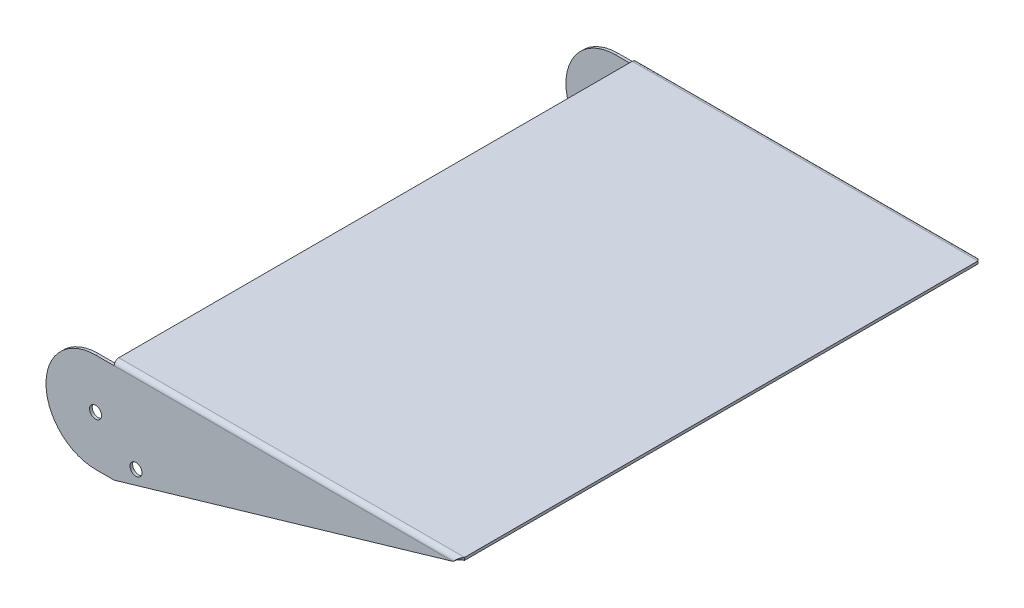
ISO-10303-21;
HEADER;
FILE_DESCRIPTION(('STEP AP214'),'2;1');
FILE_NAME('part.step','',(''),(''),'','','');
FILE_SCHEMA(('AUTOMOTIVE_DESIGN { 1 0 10303 214 1 1 1 1 }'));
ENDSEC;
DATA;
#1=APPLICATION_CONTEXT('core data for automotive mechanical design processes');
#2=APPLICATION_PROTOCOL_DEFINITION('international standard','automotive_design',2000,#1);
#3=PRODUCT_CONTEXT('',#1,'mechanical');
#4=PRODUCT('Part','Part','',(#3));
#5=PRODUCT_RELATED_PRODUCT_CATEGORY('part','',(#4));
#6=PRODUCT_DEFINITION_FORMATION('','',#4);
#7=PRODUCT_DEFINITION_CONTEXT('part definition',#1,'design');
#8=PRODUCT_DEFINITION('design','',#6,#7);
#9=PRODUCT_DEFINITION_SHAPE('','',#8);
#10=(LENGTH_UNIT() NAMED_UNIT(*) SI_UNIT(.MILLI.,.METRE.));
#11=(NAMED_UNIT(*) PLANE_ANGLE_UNIT() SI_UNIT($,.RADIAN.));
#12=(NAMED_UNIT(*) SI_UNIT($,.STERADIAN.) SOLID_ANGLE_UNIT());
#13=UNCERTAINTY_MEASURE_WITH_UNIT(LENGTH_MEASURE(1.E-05),#10,'distance_accuracy_value','');
#14=(GEOMETRIC_REPRESENTATION_CONTEXT(3) GLOBAL_UNCERTAINTY_ASSIGNED_CONTEXT((#13)) GLOBAL_UNIT_ASSIGNED_CONTEXT((#10,
#11,#12)) REPRESENTATION_CONTEXT('',''));
#15=CARTESIAN_POINT('',(0.,0.,0.));
#16=DIRECTION('',(0.,0.,1.));
#17=DIRECTION('',(1.,0.,0.));
#18=AXIS2_PLACEMENT_3D('',#15,#16,#17);
#19=CARTESIAN_POINT('',(65.,-1.,-96.5));
#20=DIRECTION('',(1.,0.,0.));
#21=DIRECTION('',(0.,0.,-1.));
#22=AXIS2_PLACEMENT_3D('',#19,#20,#21);
#23=PLANE('',#22);
#24=DIRECTION('',(0.,0.,-1.));
#25=VECTOR('',#24,1.);
#26=CARTESIAN_POINT('',(65.,0.,-96.5));
#27=LINE('',#26,#25);
#28=CARTESIAN_POINT('',(65.,0.,96.5));
#29=VERTEX_POINT('',#28);
#30=CARTESIAN_POINT('',(65.,0.,-96.5));
#31=VERTEX_POINT('',#30);
#32=EDGE_CURVE('E288',#29,#31,#27,.T.);
#33=ORIENTED_EDGE('',*,*,#32,.F.);
#34=DIRECTION('',(0.,1.,0.));
#35=VECTOR('',#34,1.);
#36=CARTESIAN_POINT('',(65.,-1.,96.5));
#37=LINE('',#36,#35);
#38=CARTESIAN_POINT('',(65.,-0.999999999999987,96.5));
#39=VERTEX_POINT('',#38);
#40=EDGE_CURVE('E13',#39,#29,#37,.T.);
#41=ORIENTED_EDGE('',*,*,#40,.F.);
#42=DIRECTION('',(0.,0.,-1.));
#43=VECTOR('',#42,1.);
#44=CARTESIAN_POINT('',(65.,-1.,-96.5));
#45=LINE('',#44,#43);
#46=CARTESIAN_POINT('',(65.,-0.99999999999999,-96.5));
#47=VERTEX_POINT('',#46);
#48=EDGE_CURVE('E304',#39,#47,#45,.T.);
#49=ORIENTED_EDGE('',*,*,#48,.T.);
#50=DIRECTION('',(0.,1.,0.));
#51=VECTOR('',#50,1.);
#52=CARTESIAN_POINT('',(65.,-1.,-96.5));
#53=LINE('',#52,#51);
#54=EDGE_CURVE('E292',#47,#31,#53,.T.);
#55=ORIENTED_EDGE('',*,*,#54,.T.);
#56=EDGE_LOOP('',(#33,#41,#49,#55));
#57=FACE_BOUND('',#56,.T.);
#58=ADVANCED_FACE('F70',(#57),#23,.T.);
#59=CARTESIAN_POINT('',(-65.,-1.,-96.5));
#60=DIRECTION('',(-1.,0.,0.));
#61=DIRECTION('',(0.,0.,1.));
#62=AXIS2_PLACEMENT_3D('',#59,#60,#61);
#63=PLANE('',#62);
#64=DIRECTION('',(0.,0.,1.));
#65=VECTOR('',#64,1.);
#66=CARTESIAN_POINT('',(-65.,0.,-96.5));
#67=LINE('',#66,#65);
#68=CARTESIAN_POINT('',(-65.,0.,-96.5));
#69=VERTEX_POINT('',#68);
#70=CARTESIAN_POINT('',(-65.,0.,96.5));
#71=VERTEX_POINT('',#70);
#72=EDGE_CURVE('E301',#69,#71,#67,.T.);
#73=ORIENTED_EDGE('',*,*,#72,.F.);
#74=DIRECTION('',(0.,1.,0.));
#75=VECTOR('',#74,1.);
#76=CARTESIAN_POINT('',(-65.,-1.,-96.5));
#77=LINE('',#76,#75);
#78=CARTESIAN_POINT('',(-65.,-1.00000000000001,-96.5));
#79=VERTEX_POINT('',#78);
#80=EDGE_CURVE('E313',#79,#69,#77,.T.);
#81=ORIENTED_EDGE('',*,*,#80,.F.);
#82=DIRECTION('',(0.,0.,1.));
#83=VECTOR('',#82,1.);
#84=CARTESIAN_POINT('',(-65.,-1.,-96.5));
#85=LINE('',#84,#83);
#86=CARTESIAN_POINT('',(-65.,-0.999999999999987,96.5));
#87=VERTEX_POINT('',#86);
#88=EDGE_CURVE('E315',#79,#87,#85,.T.);
#89=ORIENTED_EDGE('',*,*,#88,.T.);
#90=DIRECTION('',(0.,1.,0.));
#91=VECTOR('',#90,1.);
#92=CARTESIAN_POINT('',(-65.,-1.,96.5));
#93=LINE('',#92,#91);
#94=EDGE_CURVE('E78',#87,#71,#93,.T.);
#95=ORIENTED_EDGE('',*,*,#94,.T.);
#96=EDGE_LOOP('',(#73,#81,#89,#95));
#97=FACE_BOUND('',#96,.T.);
#98=ADVANCED_FACE('F277',(#97),#63,.T.);
#99=CARTESIAN_POINT('',(0.,-1.,0.));
#100=DIRECTION('',(0.,1.,0.));
#101=DIRECTION('',(0.,0.,1.));
#102=AXIS2_PLACEMENT_3D('',#99,#100,#101);
#103=PLANE('',#102);
#104=ORIENTED_EDGE('',*,*,#48,.F.);
#105=DIRECTION('',(1.,0.,0.));
#106=VECTOR('',#105,1.);
#107=CARTESIAN_POINT('',(-65.,-1.,96.5));
#108=LINE('',#107,#106);
#109=EDGE_CURVE('E314',#87,#39,#108,.T.);
#110=ORIENTED_EDGE('',*,*,#109,.F.);
#111=ORIENTED_EDGE('',*,*,#88,.F.);
#112=DIRECTION('',(-1.,0.,0.));
#113=VECTOR('',#112,1.);
#114=CARTESIAN_POINT('',(-65.,-1.,-96.5));
#115=LINE('',#114,#113);
#116=EDGE_CURVE('E306',#47,#79,#115,.T.);
#117=ORIENTED_EDGE('',*,*,#116,.F.);
#118=EDGE_LOOP('',(#104,#110,#111,#117));
#119=FACE_BOUND('',#118,.T.);
#120=ADVANCED_FACE('F282',(#119),#103,.F.);
#121=CARTESIAN_POINT('',(0.,0.,0.));
#122=DIRECTION('',(0.,1.,0.));
#123=DIRECTION('',(0.,0.,1.));
#124=AXIS2_PLACEMENT_3D('',#121,#122,#123);
#125=PLANE('',#124);
#126=ORIENTED_EDGE('',*,*,#32,.T.);
#127=DIRECTION('',(-1.,0.,0.));
#128=VECTOR('',#127,1.);
#129=CARTESIAN_POINT('',(-65.,0.,-96.5));
#130=LINE('',#129,#128);
#131=EDGE_CURVE('E295',#31,#69,#130,.T.);
#132=ORIENTED_EDGE('',*,*,#131,.T.);
#133=ORIENTED_EDGE('',*,*,#72,.T.);
#134=DIRECTION('',(1.,0.,0.));
#135=VECTOR('',#134,1.);
#136=CARTESIAN_POINT('',(-65.,0.,96.5));
#137=LINE('',#136,#135);
#138=EDGE_CURVE('E298',#71,#29,#137,.T.);
#139=ORIENTED_EDGE('',*,*,#138,.T.);
#140=EDGE_LOOP('',(#126,#132,#133,#139));
#141=FACE_BOUND('',#140,.T.);
#142=ADVANCED_FACE('F299',(#141),#125,.T.);
#143=CARTESIAN_POINT('',(65.,0.010000000000013,96.5));
#144=CARTESIAN_POINT('',(64.789983819202,0.010000000000013,96.728651709994));
#145=CARTESIAN_POINT('',(64.5800087719299,-0.0354593229311082,96.9571688548219));
#146=CARTESIAN_POINT('',(64.1600175438597,-0.210444694100442,97.3796209111158));
#147=CARTESIAN_POINT('',(63.9500219298246,-0.339901893067329,97.5733673011082));
#148=CARTESIAN_POINT('',(63.5300307017544,-0.663232698891804,97.8966981069327));
#149=CARTESIAN_POINT('',(63.3200350877193,-0.856979088884176,98.0261553058996));
#150=CARTESIAN_POINT('',(62.9000438596491,-1.27943114517807,98.2011406770689));
#151=CARTESIAN_POINT('',(62.690068812377,-1.50794829000591,98.2466));
#152=CARTESIAN_POINT('',(62.480052631579,-1.73659999999999,98.2466));
#153=CARTESIAN_POINT('',(65.,0.,96.5));
#154=CARTESIAN_POINT('',(64.7899839575628,0.,96.7273425221865));
#155=CARTESIAN_POINT('',(64.5800087719299,-0.0451990496977913,96.9545513759783));
#156=CARTESIAN_POINT('',(64.1600175438597,-0.219182557983985,97.3745847213121));
#157=CARTESIAN_POINT('',(63.9500219298246,-0.347898561491311,97.5672218339084));
#158=CARTESIAN_POINT('',(63.5300307017544,-0.669378166091553,97.8887014385087));
#159=CARTESIAN_POINT('',(63.3200350877193,-0.862015278687885,98.017417442016));
#160=CARTESIAN_POINT('',(62.9000438596491,-1.28204862402166,98.1914009503022));
#161=CARTESIAN_POINT('',(62.6900686740162,-1.50925747781347,98.2366));
#162=CARTESIAN_POINT('',(62.480052631579,-1.73659999999999,98.2366));
#163=CARTESIAN_POINT('',(65.,-0.999999999999987,96.5));
#164=CARTESIAN_POINT('',(64.7899977936404,-0.999999999999987,96.5964237414308));
#165=CARTESIAN_POINT('',(64.5800087719299,-1.01917172636611,96.692803491619));
#166=CARTESIAN_POINT('',(64.1600175438597,-1.09296894633824,96.8709657409412));
#167=CARTESIAN_POINT('',(63.9500219298246,-1.14756540388949,96.9526751139335));
#168=CARTESIAN_POINT('',(63.5300307017544,-1.28392488606647,97.0890345961105));
#169=CARTESIAN_POINT('',(63.3200350877193,-1.36563425905879,97.1436310536617));
#170=CARTESIAN_POINT('',(62.9000438596491,-1.54379650838095,97.2174282736339));
#171=CARTESIAN_POINT('',(62.6900548379386,-1.64017625856919,97.2366));
#172=CARTESIAN_POINT('',(62.480052631579,-1.7366,97.2366));
#173=CARTESIAN_POINT('',(65.,-1.01009999999999,96.5));
#174=CARTESIAN_POINT('',(64.7899979333847,-1.01009999999999,96.5951014617452));
#175=CARTESIAN_POINT('',(64.5800087719299,-1.02900885040046,96.690159837987));
#176=CARTESIAN_POINT('',(64.1600175438597,-1.10179418886062,96.8658791892395));
#177=CARTESIAN_POINT('',(63.9500219298246,-1.15564203899771,96.9464681920618));
#178=CARTESIAN_POINT('',(63.5300307017544,-1.29013180793822,97.0809579610023));
#179=CARTESIAN_POINT('',(63.3200350877193,-1.37072081076053,97.1348058111394));
#180=CARTESIAN_POINT('',(62.9000438596491,-1.54644016201298,97.2075911495995));
#181=CARTESIAN_POINT('',(62.6900546981942,-1.64149853825483,97.2265));
#182=CARTESIAN_POINT('',(62.480052631579,-1.7366,97.2265));
#183=B_SPLINE_SURFACE_WITH_KNOTS('',1,3,((#143,#144,#145,#146,#147,#148,#149,#150,#151,#152),
(#153,#154,#155,#156,#157,#158,#159,#160,#161,#162),(#163,#164,#165,#166,#167,#168,#169,#170,
#171,#172),(#173,#174,#175,#176,#177,#178,#179,#180,#181,#182)),.UNSPECIFIED.,.F.,.F.,.F.,(2,1,
1,2),(4,2,2,2,4),(-0.01,0.,1.,1.0101),(0.,0.25,0.5,0.75,1.),.UNSPECIFIED.);
#184=DIRECTION('',(0.,0.,1.));
#185=VECTOR('',#184,1.);
#186=CARTESIAN_POINT('',(62.4800526315789,-1.7366,98.2366));
#187=LINE('',#186,#185);
#188=CARTESIAN_POINT('',(62.480052631579,-1.7366,97.2366));
#189=VERTEX_POINT('',#188);
#190=CARTESIAN_POINT('',(62.480052631579,-1.7366,98.2366));
#191=VERTEX_POINT('',#190);
#192=EDGE_CURVE('E428',#189,#191,#187,.T.);
#193=CARTESIAN_POINT('',(65.,-0.999999999999987,96.5));
#194=CARTESIAN_POINT('',(64.9464752558888,-0.999997162881765,96.524574028151));
#195=CARTESIAN_POINT('',(64.8929576428406,-1.00123023660365,96.5491465611857));
#196=CARTESIAN_POINT('',(64.78592413789,-1.00614153774943,96.5980466890904));
#197=CARTESIAN_POINT('',(64.7324082459758,-1.0098197105786,96.6223742894169));
#198=CARTESIAN_POINT('',(64.5719947088296,-1.024467902898,96.6945591625107));
#199=CARTESIAN_POINT('',(64.4650773264015,-1.03905175131273,96.7416905770038));
#200=CARTESIAN_POINT('',(64.2512568350302,-1.07728894119533,96.8321134484952));
#201=CARTESIAN_POINT('',(64.1443537261229,-1.10094230497646,96.8754048960459));
#202=CARTESIAN_POINT('',(63.9304896984536,-1.15638890497578,96.9564492530929));
#203=CARTESIAN_POINT('',(63.8235287772118,-1.18818615482363,96.9941994171523));
#204=CARTESIAN_POINT('',(63.6138040935312,-1.25726493384087,97.0612881845129));
#205=CARTESIAN_POINT('',(63.5110401526759,-1.29428263780263,97.0908984992782));
#206=CARTESIAN_POINT('',(63.3054694529506,-1.37330733917706,97.1425157585522));
#207=CARTESIAN_POINT('',(63.2026626948816,-1.41531649794603,97.1645193930417));
#208=CARTESIAN_POINT('',(62.9965395117584,-1.5029820918261,97.2001793672036));
#209=CARTESIAN_POINT('',(62.8932230261076,-1.54865518151137,97.2137948279057));
#210=CARTESIAN_POINT('',(62.738280673557,-1.61847556587719,97.2274544381498));
#211=CARTESIAN_POINT('',(62.686637055964,-1.64196821658703,97.2308803794203));
#212=CARTESIAN_POINT('',(62.5833486381692,-1.68917345385699,97.2354543951372));
#213=CARTESIAN_POINT('',(62.5317038379609,-1.71288604337072,97.2366024389485));
#214=CARTESIAN_POINT('',(62.480052631579,-1.7366,97.2366));
#215=B_SPLINE_CURVE_WITH_KNOTS('',3,(#193,#194,#195,#196,#197,#198,#199,#200,#201,#202,#203,
#204,#205,#206,#207,#208,#209,#210,#211,#212,#213,#214),.UNSPECIFIED.,.F.,.F.,(4,2,2,2,2,2,2,2,
2,2,4),(0.,0.176662132093646,0.353320319768435,0.706128556772538,1.05893766177831,
1.41192098080175,1.75106821515937,2.09036284298417,2.43129817500875,2.6017761618605,
2.77225644142151),.UNSPECIFIED.);
#216=EDGE_CURVE('E450',#39,#189,#215,.T.);
#217=CARTESIAN_POINT('',(65.,0.,96.5));
#218=CARTESIAN_POINT('',(64.9419691672905,1.4515076213923E-05,96.5628143712558));
#219=CARTESIAN_POINT('',(64.8839408915327,-0.00340742292835014,96.6256282427949));
#220=CARTESIAN_POINT('',(64.7678928556056,-0.0170203634900498,96.7505130665361));
#221=CARTESIAN_POINT('',(64.7098730952211,-0.027210592060736,96.8125841028588));
#222=CARTESIAN_POINT('',(64.593875209227,-0.0542462972826829,96.9352105937025));
#223=CARTESIAN_POINT('',(64.5358970846181,-0.0710868376272431,96.9957671370109));
#224=CARTESIAN_POINT('',(64.4199382547375,-0.11122023586222,97.1147021269533));
#225=CARTESIAN_POINT('',(64.3619575494407,-0.134513287454009,97.1730805081402));
#226=CARTESIAN_POINT('',(64.2424340823399,-0.188902130035151,97.2904734278366));
#227=CARTESIAN_POINT('',(64.1808911602225,-0.220389146745193,97.3493070064811));
#228=CARTESIAN_POINT('',(64.0577866301042,-0.289925007339615,97.4629914525813));
#229=CARTESIAN_POINT('',(63.9962250235767,-0.327976265461441,97.5178408441233));
#230=CARTESIAN_POINT('',(63.8731148896899,-0.410113986189744,97.6227882467657));
#231=CARTESIAN_POINT('',(63.8115663634808,-0.454198759955337,97.6728875808351));
#232=CARTESIAN_POINT('',(63.6884693433245,-0.547829870782969,97.7676923305265));
#233=CARTESIAN_POINT('',(63.6269208493775,-0.597376214069682,97.8123977400009));
#234=CARTESIAN_POINT('',(63.503772495975,-0.701324175881258,97.8958617913331));
#235=CARTESIAN_POINT('',(63.4421726395978,-0.755730079713025,97.9346151009121));
#236=CARTESIAN_POINT('',(63.3189920817594,-0.86861455111462,98.0055978274838));
#237=CARTESIAN_POINT('',(63.2574113810599,-0.927091700457016,98.0378295011702));
#238=CARTESIAN_POINT('',(63.1342698688379,-1.04733993344537,98.0953496551173));
#239=CARTESIAN_POINT('',(63.0727090577429,-1.10910987972627,98.1206405144834));
#240=CARTESIAN_POINT('',(62.9496114961906,-1.23512495517204,98.1639532040959));
#241=CARTESIAN_POINT('',(62.8880747453629,-1.29936914800029,98.1819777551094));
#242=CARTESIAN_POINT('',(62.7687377830529,-1.42555410571501,98.2096615023071));
#243=CARTESIAN_POINT('',(62.7109372844694,-1.48739829179722,98.2197617152994));
#244=CARTESIAN_POINT('',(62.5954433810317,-1.61169526844747,98.2332315625833));
#245=CARTESIAN_POINT('',(62.5377499795907,-1.67414669275903,98.2366138424877));
#246=CARTESIAN_POINT('',(62.480052631579,-1.73659999999999,98.2366));
#247=B_SPLINE_CURVE_WITH_KNOTS('',3,(#217,#218,#219,#220,#221,#222,#223,#224,#225,#226,#227,
#228,#229,#230,#231,#232,#233,#234,#235,#236,#237,#238,#239,#240,#241,#242,#243,#244,#245,#246),
.UNSPECIFIED.,.F.,.F.,(4,2,2,2,2,2,2,2,2,2,2,2,2,2,4),(0.,0.256480672542403,0.512932020339809,
0.769193369498647,1.0254624123372,1.29746385424619,1.5695655486468,1.84159123426373,
2.11361722991762,2.38588552030519,2.65805943546124,2.9301399406105,3.20211847420016,
3.45760327249073,3.71260669722768),.UNSPECIFIED.);
#248=EDGE_CURVE('E86',#29,#191,#247,.T.);
#249=ORIENTED_EDGE('',*,*,#192,.F.);
#250=ORIENTED_EDGE('',*,*,#216,.F.);
#251=ORIENTED_EDGE('',*,*,#40,.T.);
#252=ORIENTED_EDGE('',*,*,#248,.T.);
#253=EDGE_LOOP('',(#249,#250,#251,#252));
#254=FACE_BOUND('',#253,.T.);
#255=ADVANCED_FACE('F464',(#254),#183,.F.);
#256=CARTESIAN_POINT('',(-65.,-1.7366,96.5));
#257=DIRECTION('',(1.,0.,0.));
#258=DIRECTION('',(0.,0.,-1.));
#259=AXIS2_PLACEMENT_3D('',#256,#257,#258);
#260=PLANE('',#259);
#261=CARTESIAN_POINT('',(-65.,-1.7366,96.5));
#262=DIRECTION('',(-1.,0.,0.));
#263=DIRECTION('',(0.,0.,1.));
#264=AXIS2_PLACEMENT_3D('',#261,#262,#263);
#265=CIRCLE('',#264,0.736600000000018);
#266=CARTESIAN_POINT('',(-65.,-1.7366,97.2366));
#267=VERTEX_POINT('',#266);
#268=EDGE_CURVE('E433',#267,#87,#265,.T.);
#269=ORIENTED_EDGE('',*,*,#268,.F.);
#270=DIRECTION('',(0.,0.,1.));
#271=VECTOR('',#270,1.);
#272=CARTESIAN_POINT('',(-65.,-1.7366,97.2366));
#273=LINE('',#272,#271);
#274=CARTESIAN_POINT('',(-65.,-1.7366,98.2366));
#275=VERTEX_POINT('',#274);
#276=EDGE_CURVE('E442',#267,#275,#273,.T.);
#277=ORIENTED_EDGE('',*,*,#276,.T.);
#278=CARTESIAN_POINT('',(-65.,-1.7366,96.5));
#279=DIRECTION('',(-1.,0.,0.));
#280=DIRECTION('',(0.,0.,1.));
#281=AXIS2_PLACEMENT_3D('',#278,#279,#280);
#282=CIRCLE('',#281,1.73660000000002);
#283=EDGE_CURVE('E448',#275,#71,#282,.T.);
#284=ORIENTED_EDGE('',*,*,#283,.T.);
#285=ORIENTED_EDGE('',*,*,#94,.F.);
#286=EDGE_LOOP('',(#269,#277,#284,#285));
#287=FACE_BOUND('',#286,.T.);
#288=ADVANCED_FACE('F474',(#287),#260,.F.);
#289=CARTESIAN_POINT('',(-65.,-1.7366,96.5));
#290=DIRECTION('',(-1.,0.,0.));
#291=DIRECTION('',(0.,0.,1.));
#292=AXIS2_PLACEMENT_3D('',#289,#290,#291);
#293=CYLINDRICAL_SURFACE('',#292,1.73660000000002);
#294=ORIENTED_EDGE('',*,*,#138,.F.);
#295=ORIENTED_EDGE('',*,*,#283,.F.);
#296=DIRECTION('',(-1.,0.,0.));
#297=VECTOR('',#296,1.);
#298=CARTESIAN_POINT('',(0.,-1.7366,98.2366));
#299=LINE('',#298,#297);
#300=EDGE_CURVE('E439',#191,#275,#299,.T.);
#301=ORIENTED_EDGE('',*,*,#300,.F.);
#302=ORIENTED_EDGE('',*,*,#248,.F.);
#303=EDGE_LOOP('',(#294,#295,#301,#302));
#304=FACE_BOUND('',#303,.T.);
#305=ADVANCED_FACE('F469',(#304),#293,.T.);
#306=CARTESIAN_POINT('',(-65.,-1.7366,96.5));
#307=DIRECTION('',(-1.,0.,0.));
#308=DIRECTION('',(0.,0.,1.));
#309=AXIS2_PLACEMENT_3D('',#306,#307,#308);
#310=CYLINDRICAL_SURFACE('',#309,0.736600000000018);
#311=ORIENTED_EDGE('',*,*,#109,.T.);
#312=ORIENTED_EDGE('',*,*,#216,.T.);
#313=DIRECTION('',(1.,0.,0.));
#314=VECTOR('',#313,1.);
#315=CARTESIAN_POINT('',(62.4800526315789,-1.7366,97.2366));
#316=LINE('',#315,#314);
#317=EDGE_CURVE('E400',#189,#267,#316,.F.);
#318=ORIENTED_EDGE('',*,*,#317,.T.);
#319=ORIENTED_EDGE('',*,*,#268,.T.);
#320=EDGE_LOOP('',(#311,#312,#318,#319));
#321=FACE_BOUND('',#320,.T.);
#322=ADVANCED_FACE('F473',(#321),#310,.F.);
#323=CARTESIAN_POINT('',(65.,-0.999999999999997,98.2366));
#324=DIRECTION('',(0.280566991812824,-0.959834445675452,0.));
#325=DIRECTION('',(0.959834445675452,0.280566991812824,0.));
#326=AXIS2_PLACEMENT_3D('',#323,#324,#325);
#327=PLANE('',#326);
#328=DIRECTION('',(0.959834445675452,0.280566991812824,0.));
#329=VECTOR('',#328,1.);
#330=CARTESIAN_POINT('',(5.38595726122993,-18.425643262102,97.2366000000001));
#331=LINE('',#330,#329);
#332=CARTESIAN_POINT('',(-65.,-39.,97.2366));
#333=VERTEX_POINT('',#332);
#334=EDGE_CURVE('E437',#189,#333,#331,.F.);
#335=ORIENTED_EDGE('',*,*,#334,.F.);
#336=ORIENTED_EDGE('',*,*,#192,.T.);
#337=DIRECTION('',(-0.959834445675452,-0.280566991812824,0.));
#338=VECTOR('',#337,1.);
#339=CARTESIAN_POINT('',(65.,-0.999999999999997,98.2366));
#340=LINE('',#339,#338);
#341=CARTESIAN_POINT('',(-65.,-39.,98.2366));
#342=VERTEX_POINT('',#341);
#343=EDGE_CURVE('E434',#191,#342,#340,.T.);
#344=ORIENTED_EDGE('',*,*,#343,.T.);
#345=DIRECTION('',(0.,0.,-1.));
#346=VECTOR('',#345,1.);
#347=CARTESIAN_POINT('',(-65.,-39.,98.2366000000001));
#348=LINE('',#347,#346);
#349=EDGE_CURVE('E430',#342,#333,#348,.T.);
#350=ORIENTED_EDGE('',*,*,#349,.T.);
#351=EDGE_LOOP('',(#335,#336,#344,#350));
#352=FACE_BOUND('',#351,.T.);
#353=ADVANCED_FACE('F475',(#352),#327,.T.);
#354=CARTESIAN_POINT('',(0.,3.55914250668868E-13,98.2366));
#355=DIRECTION('',(0.,0.,1.));
#356=DIRECTION('',(0.,-1.,0.));
#357=AXIS2_PLACEMENT_3D('',#354,#355,#356);
#358=PLANE('',#357);
#359=CARTESIAN_POINT('',(-56.8044905023096,-31.3951578534945,98.2366));
#360=DIRECTION('',(0.,0.,1.));
#361=DIRECTION('',(1.,0.,0.));
#362=AXIS2_PLACEMENT_3D('',#359,#360,#361);
#363=CIRCLE('',#362,2.24999999999999);
#364=CARTESIAN_POINT('',(-54.5544905023096,-31.3951578534945,98.2366));
#365=VERTEX_POINT('',#364);
#366=EDGE_CURVE('E362',#365,#365,#363,.T.);
#367=ORIENTED_EDGE('',*,*,#366,.F.);
#368=EDGE_LOOP('',(#367));
#369=FACE_BOUND('',#368,.T.);
#370=ORIENTED_EDGE('',*,*,#343,.F.);
#371=ORIENTED_EDGE('',*,*,#300,.T.);
#372=DIRECTION('',(-1.,0.,0.));
#373=VECTOR('',#372,1.);
#374=CARTESIAN_POINT('',(-72.,-1.7366,98.2366));
#375=LINE('',#374,#373);
#376=CARTESIAN_POINT('',(-72.,-1.7366,98.2366));
#377=VERTEX_POINT('',#376);
#378=EDGE_CURVE('E416',#275,#377,#375,.T.);
#379=ORIENTED_EDGE('',*,*,#378,.T.);
#380=CARTESIAN_POINT('',(-72.,-20.3683,98.2366));
#381=DIRECTION('',(0.,0.,1.));
#382=DIRECTION('',(-1.,0.,0.));
#383=AXIS2_PLACEMENT_3D('',#380,#381,#382);
#384=CIRCLE('',#383,18.6317);
#385=CARTESIAN_POINT('',(-72.,-39.,98.2366));
#386=VERTEX_POINT('',#385);
#387=EDGE_CURVE('E405',#377,#386,#384,.T.);
#388=ORIENTED_EDGE('',*,*,#387,.T.);
#389=DIRECTION('',(1.,0.,0.));
#390=VECTOR('',#389,1.);
#391=CARTESIAN_POINT('',(-72.,-39.,98.2366));
#392=LINE('',#391,#390);
#393=EDGE_CURVE('E407',#386,#342,#392,.T.);
#394=ORIENTED_EDGE('',*,*,#393,.T.);
#395=EDGE_LOOP('',(#370,#371,#379,#388,#394));
#396=FACE_BOUND('',#395,.T.);
#397=CARTESIAN_POINT('',(-72.,-20.3683,98.2366));
#398=DIRECTION('',(0.,0.,1.));
#399=DIRECTION('',(1.,0.,0.));
#400=AXIS2_PLACEMENT_3D('',#397,#398,#399);
#401=CIRCLE('',#400,2.25);
#402=CARTESIAN_POINT('',(-69.75,-20.3683,98.2366));
#403=VERTEX_POINT('',#402);
#404=EDGE_CURVE('E230',#403,#403,#401,.T.);
#405=ORIENTED_EDGE('',*,*,#404,.F.);
#406=EDGE_LOOP('',(#405));
#407=FACE_BOUND('',#406,.T.);
#408=ADVANCED_FACE('F394',(#369,#396,#407),#358,.T.);
#409=CARTESIAN_POINT('',(0.,3.52422769330025E-13,97.2366));
#410=DIRECTION('',(0.,0.,1.));
#411=DIRECTION('',(0.,-1.,0.));
#412=AXIS2_PLACEMENT_3D('',#409,#410,#411);
#413=PLANE('',#412);
#414=CARTESIAN_POINT('',(-56.8044905023096,-31.3951578534945,97.2366000000001));
#415=DIRECTION('',(0.,0.,1.));
#416=DIRECTION('',(0.,-1.,0.));
#417=AXIS2_PLACEMENT_3D('',#414,#415,#416);
#418=CIRCLE('',#417,2.24999999999999);
#419=CARTESIAN_POINT('',(-56.8044905023096,-33.6451578534945,97.2366000000001));
#420=VERTEX_POINT('',#419);
#421=EDGE_CURVE('E357',#420,#420,#418,.T.);
#422=ORIENTED_EDGE('',*,*,#421,.T.);
#423=EDGE_LOOP('',(#422));
#424=FACE_BOUND('',#423,.T.);
#425=ORIENTED_EDGE('',*,*,#317,.F.);
#426=ORIENTED_EDGE('',*,*,#334,.T.);
#427=DIRECTION('',(1.,0.,0.));
#428=VECTOR('',#427,1.);
#429=CARTESIAN_POINT('',(-72.,-39.,97.2366));
#430=LINE('',#429,#428);
#431=CARTESIAN_POINT('',(-72.,-39.,97.2366));
#432=VERTEX_POINT('',#431);
#433=EDGE_CURVE('E415',#432,#333,#430,.T.);
#434=ORIENTED_EDGE('',*,*,#433,.F.);
#435=CARTESIAN_POINT('',(-72.,-20.3683,97.2366));
#436=DIRECTION('',(0.,0.,1.));
#437=DIRECTION('',(-1.,0.,0.));
#438=AXIS2_PLACEMENT_3D('',#435,#436,#437);
#439=CIRCLE('',#438,18.6317);
#440=CARTESIAN_POINT('',(-72.,-1.7366,97.2366));
#441=VERTEX_POINT('',#440);
#442=EDGE_CURVE('E412',#441,#432,#439,.T.);
#443=ORIENTED_EDGE('',*,*,#442,.F.);
#444=DIRECTION('',(-1.,0.,0.));
#445=VECTOR('',#444,1.);
#446=CARTESIAN_POINT('',(-72.,-1.7366,97.2366));
#447=LINE('',#446,#445);
#448=EDGE_CURVE('E418',#267,#441,#447,.T.);
#449=ORIENTED_EDGE('',*,*,#448,.F.);
#450=EDGE_LOOP('',(#425,#426,#434,#443,#449));
#451=FACE_BOUND('',#450,.T.);
#452=CARTESIAN_POINT('',(-72.,-20.3683,97.2366));
#453=DIRECTION('',(0.,0.,1.));
#454=DIRECTION('',(1.,0.,0.));
#455=AXIS2_PLACEMENT_3D('',#452,#453,#454);
#456=CIRCLE('',#455,2.25);
#457=CARTESIAN_POINT('',(-69.75,-20.3683,97.2366));
#458=VERTEX_POINT('',#457);
#459=EDGE_CURVE('E404',#458,#458,#456,.T.);
#460=ORIENTED_EDGE('',*,*,#459,.T.);
#461=EDGE_LOOP('',(#460));
#462=FACE_BOUND('',#461,.T.);
#463=ADVANCED_FACE('F390',(#424,#451,#462),#413,.F.);
#464=CARTESIAN_POINT('',(-72.,-20.3683,97.2366));
#465=DIRECTION('',(0.,0.,1.));
#466=DIRECTION('',(1.,0.,0.));
#467=AXIS2_PLACEMENT_3D('',#464,#465,#466);
#468=CYLINDRICAL_SURFACE('',#467,18.6317);
#469=ORIENTED_EDGE('',*,*,#387,.F.);
#470=DIRECTION('',(0.,0.,1.));
#471=VECTOR('',#470,1.);
#472=CARTESIAN_POINT('',(-72.,-1.7366,97.2366));
#473=LINE('',#472,#471);
#474=EDGE_CURVE('E426',#441,#377,#473,.T.);
#475=ORIENTED_EDGE('',*,*,#474,.F.);
#476=ORIENTED_EDGE('',*,*,#442,.T.);
#477=DIRECTION('',(0.,0.,1.));
#478=VECTOR('',#477,1.);
#479=CARTESIAN_POINT('',(-72.,-39.,97.2366));
#480=LINE('',#479,#478);
#481=EDGE_CURVE('E420',#432,#386,#480,.T.);
#482=ORIENTED_EDGE('',*,*,#481,.T.);
#483=EDGE_LOOP('',(#469,#475,#476,#482));
#484=FACE_BOUND('',#483,.T.);
#485=ADVANCED_FACE('F393',(#484),#468,.T.);
#486=CARTESIAN_POINT('',(-72.,-1.7366,97.2366));
#487=DIRECTION('',(0.,1.,0.));
#488=DIRECTION('',(0.,0.,1.));
#489=AXIS2_PLACEMENT_3D('',#486,#487,#488);
#490=PLANE('',#489);
#491=ORIENTED_EDGE('',*,*,#378,.F.);
#492=ORIENTED_EDGE('',*,*,#276,.F.);
#493=ORIENTED_EDGE('',*,*,#448,.T.);
#494=ORIENTED_EDGE('',*,*,#474,.T.);
#495=EDGE_LOOP('',(#491,#492,#493,#494));
#496=FACE_BOUND('',#495,.T.);
#497=ADVANCED_FACE('F495',(#496),#490,.T.);
#498=CARTESIAN_POINT('',(-72.,-39.,97.2366));
#499=DIRECTION('',(0.,-1.,0.));
#500=DIRECTION('',(0.,0.,-1.));
#501=AXIS2_PLACEMENT_3D('',#498,#499,#500);
#502=PLANE('',#501);
#503=ORIENTED_EDGE('',*,*,#393,.F.);
#504=ORIENTED_EDGE('',*,*,#481,.F.);
#505=ORIENTED_EDGE('',*,*,#433,.T.);
#506=ORIENTED_EDGE('',*,*,#349,.F.);
#507=EDGE_LOOP('',(#503,#504,#505,#506));
#508=FACE_BOUND('',#507,.T.);
#509=ADVANCED_FACE('F273',(#508),#502,.T.);
#510=CARTESIAN_POINT('',(-72.,-20.3683,97.2366));
#511=DIRECTION('',(0.,0.,1.));
#512=DIRECTION('',(1.,0.,0.));
#513=AXIS2_PLACEMENT_3D('',#510,#511,#512);
#514=CYLINDRICAL_SURFACE('',#513,2.25);
#515=ORIENTED_EDGE('',*,*,#459,.F.);
#516=EDGE_LOOP('',(#515));
#517=FACE_BOUND('',#516,.T.);
#518=ORIENTED_EDGE('',*,*,#404,.T.);
#519=EDGE_LOOP('',(#518));
#520=FACE_BOUND('',#519,.T.);
#521=ADVANCED_FACE('F266',(#517,#520),#514,.F.);
#522=CARTESIAN_POINT('',(-65.,-1.73660000000001,-96.5));
#523=DIRECTION('',(-1.,0.,0.));
#524=DIRECTION('',(0.,-1.,0.));
#525=AXIS2_PLACEMENT_3D('',#522,#523,#524);
#526=PLANE('',#525);
#527=DIRECTION('',(0.,0.,1.));
#528=VECTOR('',#527,1.);
#529=CARTESIAN_POINT('',(-65.,-1.7366,-98.2366));
#530=LINE('',#529,#528);
#531=CARTESIAN_POINT('',(-65.,-1.7366,-97.2366));
#532=VERTEX_POINT('',#531);
#533=CARTESIAN_POINT('',(-65.,-1.73660000000001,-98.2366));
#534=VERTEX_POINT('',#533);
#535=EDGE_CURVE('E211',#532,#534,#530,.F.);
#536=ORIENTED_EDGE('',*,*,#535,.F.);
#537=CARTESIAN_POINT('',(-65.,-1.73660000000001,-96.5));
#538=DIRECTION('',(1.,0.,0.));
#539=DIRECTION('',(0.,1.,0.));
#540=AXIS2_PLACEMENT_3D('',#537,#538,#539);
#541=CIRCLE('',#540,0.736600000000004);
#542=EDGE_CURVE('E232',#79,#532,#541,.F.);
#543=ORIENTED_EDGE('',*,*,#542,.F.);
#544=ORIENTED_EDGE('',*,*,#80,.T.);
#545=CARTESIAN_POINT('',(-65.,-1.73660000000001,-96.5));
#546=DIRECTION('',(1.,0.,0.));
#547=DIRECTION('',(0.,1.,0.));
#548=AXIS2_PLACEMENT_3D('',#545,#546,#547);
#549=CIRCLE('',#548,1.7366);
#550=EDGE_CURVE('E93',#69,#534,#549,.F.);
#551=ORIENTED_EDGE('',*,*,#550,.T.);
#552=EDGE_LOOP('',(#536,#543,#544,#551));
#553=FACE_BOUND('',#552,.T.);
#554=ADVANCED_FACE('F264',(#553),#526,.T.);
#555=CARTESIAN_POINT('',(62.480052631579,-1.73659999999998,-98.2466));
#556=CARTESIAN_POINT('',(62.690068812377,-1.50794829000592,-98.2466));
#557=CARTESIAN_POINT('',(62.9000438596492,-1.27943114517807,-98.2011406770689));
#558=CARTESIAN_POINT('',(63.3200350877194,-0.856979088884173,-98.0261553058995));
#559=CARTESIAN_POINT('',(63.5300307017544,-0.663232698891801,-97.8966981069326));
#560=CARTESIAN_POINT('',(63.9500219298246,-0.339901893067328,-97.5733673011082));
#561=CARTESIAN_POINT('',(64.1600175438597,-0.210444694100439,-97.3796209111158));
#562=CARTESIAN_POINT('',(64.5800087719299,-0.0354593229311079,-96.9571688548219));
#563=CARTESIAN_POINT('',(64.789983819202,0.0100000000000097,-96.728651709994));
#564=CARTESIAN_POINT('',(65.,0.0100000000000098,-96.5));
#565=CARTESIAN_POINT('',(62.480052631579,-1.73659999999998,-98.2366));
#566=CARTESIAN_POINT('',(62.6900686740162,-1.50925747781347,-98.2366));
#567=CARTESIAN_POINT('',(62.9000438596492,-1.28204862402166,-98.1914009503022));
#568=CARTESIAN_POINT('',(63.3200350877194,-0.862015278687882,-98.017417442016));
#569=CARTESIAN_POINT('',(63.5300307017544,-0.66937816609155,-97.8887014385087));
#570=CARTESIAN_POINT('',(63.9500219298246,-0.347898561491309,-97.5672218339084));
#571=CARTESIAN_POINT('',(64.1600175438597,-0.219182557983982,-97.3745847213121));
#572=CARTESIAN_POINT('',(64.5800087719299,-0.0451990496977911,-96.9545513759783));
#573=CARTESIAN_POINT('',(64.7899839575628,0.,-96.7273425221865));
#574=CARTESIAN_POINT('',(65.,0.,-96.5));
#575=CARTESIAN_POINT('',(62.480052631579,-1.73659999999999,-97.2366));
#576=CARTESIAN_POINT('',(62.6900548379386,-1.6401762585692,-97.2366));
#577=CARTESIAN_POINT('',(62.9000438596492,-1.54379650838094,-97.2174282736339));
#578=CARTESIAN_POINT('',(63.3200350877194,-1.36563425905879,-97.1436310536617));
#579=CARTESIAN_POINT('',(63.5300307017544,-1.28392488606647,-97.0890345961105));
#580=CARTESIAN_POINT('',(63.9500219298246,-1.14756540388949,-96.9526751139335));
#581=CARTESIAN_POINT('',(64.1600175438597,-1.09296894633824,-96.8709657409412));
#582=CARTESIAN_POINT('',(64.5800087719299,-1.01917172636611,-96.692803491619));
#583=CARTESIAN_POINT('',(64.7899977936404,-0.99999999999999,-96.5964237414308));
#584=CARTESIAN_POINT('',(65.,-0.99999999999999,-96.5));
#585=CARTESIAN_POINT('',(62.480052631579,-1.73659999999999,-97.2265));
#586=CARTESIAN_POINT('',(62.6900546981942,-1.64149853825483,-97.2265));
#587=CARTESIAN_POINT('',(62.9000438596492,-1.54644016201297,-97.2075911495995));
#588=CARTESIAN_POINT('',(63.3200350877194,-1.37072081076053,-97.1348058111394));
#589=CARTESIAN_POINT('',(63.5300307017544,-1.29013180793821,-97.0809579610023));
#590=CARTESIAN_POINT('',(63.9500219298246,-1.15564203899771,-96.9464681920618));
#591=CARTESIAN_POINT('',(64.1600175438597,-1.10179418886062,-96.8658791892395));
#592=CARTESIAN_POINT('',(64.5800087719299,-1.02900885040046,-96.690159837987));
#593=CARTESIAN_POINT('',(64.7899979333848,-1.01009999999999,-96.5951014617452));
#594=CARTESIAN_POINT('',(65.,-1.01009999999999,-96.5));
#595=B_SPLINE_SURFACE_WITH_KNOTS('',1,3,((#555,#556,#557,#558,#559,#560,#561,#562,#563,#564),
(#565,#566,#567,#568,#569,#570,#571,#572,#573,#574),(#575,#576,#577,#578,#579,#580,#581,#582,
#583,#584),(#585,#586,#587,#588,#589,#590,#591,#592,#593,#594)),.UNSPECIFIED.,.F.,.F.,.F.,(2,1,
1,2),(4,2,2,2,4),(-0.01,0.,1.,1.0101),(0.,0.25,0.5,0.75,1.),.UNSPECIFIED.);
#596=CARTESIAN_POINT('',(62.480052631579,-1.73659999999999,-97.2366));
#597=CARTESIAN_POINT('',(62.5335773756902,-1.71202597184899,-97.2366028371182));
#598=CARTESIAN_POINT('',(62.5870949887384,-1.68745343881426,-97.2353697633963));
#599=CARTESIAN_POINT('',(62.694128493689,-1.6385533109096,-97.2304584622506));
#600=CARTESIAN_POINT('',(62.7476443856032,-1.61422571058308,-97.2267802894214));
#601=CARTESIAN_POINT('',(62.9080579227495,-1.54204083748931,-97.212132097102));
#602=CARTESIAN_POINT('',(63.0149753051776,-1.49490942299624,-97.1975482486873));
#603=CARTESIAN_POINT('',(63.2287957965488,-1.40448655150485,-97.1593110588046));
#604=CARTESIAN_POINT('',(63.3356989054561,-1.36119510395413,-97.1356576950235));
#605=CARTESIAN_POINT('',(63.5495629331254,-1.28015074690714,-97.0802110950242));
#606=CARTESIAN_POINT('',(63.6565238543672,-1.24240058284774,-97.0484138451764));
#607=CARTESIAN_POINT('',(63.8662485380478,-1.17531181548715,-96.9793350661592));
#608=CARTESIAN_POINT('',(63.969012478903,-1.14570150072179,-96.9423173621974));
#609=CARTESIAN_POINT('',(64.1745831786284,-1.09408424144777,-96.8632926608229));
#610=CARTESIAN_POINT('',(64.2773899366973,-1.07208060695831,-96.821283502054));
#611=CARTESIAN_POINT('',(64.4835131198205,-1.03642063279637,-96.7336179081739));
#612=CARTESIAN_POINT('',(64.5868296054713,-1.02280517209429,-96.6879448184886));
#613=CARTESIAN_POINT('',(64.741771958022,-1.00914556185021,-96.6181244341228));
#614=CARTESIAN_POINT('',(64.793415575615,-1.00571962057967,-96.594631783413));
#615=CARTESIAN_POINT('',(64.8967039934097,-1.00114560486283,-96.547426546143));
#616=CARTESIAN_POINT('',(64.9483487936181,-0.999997561051526,-96.5237139566293));
#617=CARTESIAN_POINT('',(65.,-0.99999999999999,-96.5));
#618=B_SPLINE_CURVE_WITH_KNOTS('',3,(#596,#597,#598,#599,#600,#601,#602,#603,#604,#605,#606,
#607,#608,#609,#610,#611,#612,#613,#614,#615,#616,#617),.UNSPECIFIED.,.F.,.F.,(4,2,2,2,2,2,2,2,
2,2,4),(0.,0.176662132093663,0.353320319768443,0.706128556772556,1.05893766177827,
1.41192098080168,1.7510682151593,2.0903628429841,2.43129817500869,2.60177616186044,
2.77225644142148),.UNSPECIFIED.);
#619=CARTESIAN_POINT('',(62.480052631579,-1.73659999999999,-97.2366));
#620=VERTEX_POINT('',#619);
#621=EDGE_CURVE('E216',#620,#47,#618,.T.);
#622=DIRECTION('',(0.,0.,1.));
#623=VECTOR('',#622,1.);
#624=CARTESIAN_POINT('',(62.480052631579,-1.73659999999999,-97.2365999999985));
#625=LINE('',#624,#623);
#626=CARTESIAN_POINT('',(62.480052631579,-1.73659999999998,-98.2366));
#627=VERTEX_POINT('',#626);
#628=EDGE_CURVE('E224',#620,#627,#625,.F.);
#629=CARTESIAN_POINT('',(62.480052631579,-1.73659999999998,-98.2366));
#630=CARTESIAN_POINT('',(62.5380834642885,-1.67378562874415,-98.2366145150762));
#631=CARTESIAN_POINT('',(62.5961117400463,-1.61097175720506,-98.2331925770716));
#632=CARTESIAN_POINT('',(62.7121597759734,-1.48608693346387,-98.2195796365099));
#633=CARTESIAN_POINT('',(62.7701795363579,-1.42401589714114,-98.2093894079392));
#634=CARTESIAN_POINT('',(62.886177422352,-1.30138940629749,-98.1823537027173));
#635=CARTESIAN_POINT('',(62.944155546961,-1.24083286298906,-98.1655131623727));
#636=CARTESIAN_POINT('',(63.0601143768416,-1.12189787304665,-98.1253797641377));
#637=CARTESIAN_POINT('',(63.1180950821384,-1.06351949185978,-98.102086712546));
#638=CARTESIAN_POINT('',(63.2376185492392,-0.946126572163352,-98.0476978699648));
#639=CARTESIAN_POINT('',(63.2991614713566,-0.887292993518855,-98.0162108532548));
#640=CARTESIAN_POINT('',(63.4222660014748,-0.773608547418694,-97.9466749926603));
#641=CARTESIAN_POINT('',(63.4838276080024,-0.718759155876692,-97.9086237345385));
#642=CARTESIAN_POINT('',(63.6069377418891,-0.613811753234235,-97.8264860138102));
#643=CARTESIAN_POINT('',(63.6684862680983,-0.563712419164908,-97.7824012400446));
#644=CARTESIAN_POINT('',(63.7915832882545,-0.468907669473503,-97.688770129217));
#645=CARTESIAN_POINT('',(63.8531317822015,-0.424202259999123,-97.6392237859303));
#646=CARTESIAN_POINT('',(63.976280135604,-0.340738208666867,-97.5352758241187));
#647=CARTESIAN_POINT('',(64.0378799919813,-0.301984899087914,-97.4808699202869));
#648=CARTESIAN_POINT('',(64.1610605498196,-0.231002172516224,-97.3679854488854));
#649=CARTESIAN_POINT('',(64.2226412505191,-0.19877049882977,-97.309508299543));
#650=CARTESIAN_POINT('',(64.3457827627411,-0.141250344882691,-97.1892600665546));
#651=CARTESIAN_POINT('',(64.4073435738361,-0.115959485516586,-97.1274901202737));
#652=CARTESIAN_POINT('',(64.5304411353883,-0.072646795904102,-97.0014750448279));
#653=CARTESIAN_POINT('',(64.591977886216,-0.0546222448906273,-96.9372308519997));
#654=CARTESIAN_POINT('',(64.7113148485261,-0.026938497692907,-96.811045894285));
#655=CARTESIAN_POINT('',(64.7691153471096,-0.016838284700571,-96.7492017082028));
#656=CARTESIAN_POINT('',(64.8846092505473,-0.00336843741672441,-96.6249047315525));
#657=CARTESIAN_POINT('',(64.9423026519882,1.38424876835867E-05,-96.562453307241));
#658=CARTESIAN_POINT('',(65.,0.,-96.5));
#659=B_SPLINE_CURVE_WITH_KNOTS('',3,(#629,#630,#631,#632,#633,#634,#635,#636,#637,#638,#639,
#640,#641,#642,#643,#644,#645,#646,#647,#648,#649,#650,#651,#652,#653,#654,#655,#656,#657,#658),
.UNSPECIFIED.,.F.,.F.,(4,2,2,2,2,2,2,2,2,2,2,2,2,2,4),(0.,0.256480672542383,0.512932020339813,
0.769193369498671,1.02546241233724,1.29746385424621,1.56956554864681,1.84159123426375,
2.11361722991763,2.38588552030517,2.65805943546122,2.93013994061044,3.20211847420009,
3.45760327249067,3.71260669722765),.UNSPECIFIED.);
#660=EDGE_CURVE('E231',#627,#31,#659,.T.);
#661=ORIENTED_EDGE('',*,*,#621,.F.);
#662=ORIENTED_EDGE('',*,*,#628,.T.);
#663=ORIENTED_EDGE('',*,*,#660,.T.);
#664=ORIENTED_EDGE('',*,*,#54,.F.);
#665=EDGE_LOOP('',(#661,#662,#663,#664));
#666=FACE_BOUND('',#665,.T.);
#667=ADVANCED_FACE('F248',(#666),#595,.F.);
#668=CARTESIAN_POINT('',(65.,-1.73659999999999,-96.5));
#669=DIRECTION('',(1.,0.,0.));
#670=DIRECTION('',(0.,0.,-1.));
#671=AXIS2_PLACEMENT_3D('',#668,#669,#670);
#672=CYLINDRICAL_SURFACE('',#671,1.7366);
#673=ORIENTED_EDGE('',*,*,#131,.F.);
#674=ORIENTED_EDGE('',*,*,#660,.F.);
#675=DIRECTION('',(1.,0.,0.));
#676=VECTOR('',#675,1.);
#677=CARTESIAN_POINT('',(0.,-1.73659999999999,-98.2366));
#678=LINE('',#677,#676);
#679=EDGE_CURVE('E221',#534,#627,#678,.T.);
#680=ORIENTED_EDGE('',*,*,#679,.F.);
#681=ORIENTED_EDGE('',*,*,#550,.F.);
#682=EDGE_LOOP('',(#673,#674,#680,#681));
#683=FACE_BOUND('',#682,.T.);
#684=ADVANCED_FACE('F254',(#683),#672,.T.);
#685=CARTESIAN_POINT('',(65.,-1.73659999999999,-96.5));
#686=DIRECTION('',(1.,0.,0.));
#687=DIRECTION('',(0.,0.,-1.));
#688=AXIS2_PLACEMENT_3D('',#685,#686,#687);
#689=CYLINDRICAL_SURFACE('',#688,0.736600000000004);
#690=ORIENTED_EDGE('',*,*,#116,.T.);
#691=ORIENTED_EDGE('',*,*,#542,.T.);
#692=DIRECTION('',(-1.,0.,0.));
#693=VECTOR('',#692,1.);
#694=CARTESIAN_POINT('',(-65.,-1.7366,-97.2366));
#695=LINE('',#694,#693);
#696=EDGE_CURVE('E180',#532,#620,#695,.F.);
#697=ORIENTED_EDGE('',*,*,#696,.T.);
#698=ORIENTED_EDGE('',*,*,#621,.T.);
#699=EDGE_LOOP('',(#690,#691,#697,#698));
#700=FACE_BOUND('',#699,.T.);
#701=ADVANCED_FACE('F258',(#700),#689,.F.);
#702=CARTESIAN_POINT('',(65.,-0.999999999999997,-98.2366));
#703=DIRECTION('',(-0.280566991812824,0.959834445675452,0.));
#704=DIRECTION('',(-0.959834445675452,-0.280566991812824,0.));
#705=AXIS2_PLACEMENT_3D('',#702,#703,#704);
#706=PLANE('',#705);
#707=ORIENTED_EDGE('',*,*,#628,.F.);
#708=DIRECTION('',(-0.959834445675452,-0.280566991812824,0.));
#709=VECTOR('',#708,1.);
#710=CARTESIAN_POINT('',(65.,-1.,-97.2366));
#711=LINE('',#710,#709);
#712=CARTESIAN_POINT('',(-65.,-39.,-97.2366000000001));
#713=VERTEX_POINT('',#712);
#714=EDGE_CURVE('E219',#620,#713,#711,.T.);
#715=ORIENTED_EDGE('',*,*,#714,.T.);
#716=DIRECTION('',(0.,0.,1.));
#717=VECTOR('',#716,1.);
#718=CARTESIAN_POINT('',(-65.,-39.,-98.2366000000001));
#719=LINE('',#718,#717);
#720=CARTESIAN_POINT('',(-65.,-39.,-98.2366000000001));
#721=VERTEX_POINT('',#720);
#722=EDGE_CURVE('E213',#721,#713,#719,.T.);
#723=ORIENTED_EDGE('',*,*,#722,.F.);
#724=DIRECTION('',(0.959834445675452,0.280566991812824,0.));
#725=VECTOR('',#724,1.);
#726=CARTESIAN_POINT('',(5.38595726122993,-18.425643262102,-98.2366000000001));
#727=LINE('',#726,#725);
#728=EDGE_CURVE('E217',#627,#721,#727,.F.);
#729=ORIENTED_EDGE('',*,*,#728,.F.);
#730=EDGE_LOOP('',(#707,#715,#723,#729));
#731=FACE_BOUND('',#730,.T.);
#732=ADVANCED_FACE('F259',(#731),#706,.F.);
#733=CARTESIAN_POINT('',(0.,3.55914250668868E-13,-98.2366));
#734=DIRECTION('',(0.,0.,-1.));
#735=DIRECTION('',(0.,-1.,0.));
#736=AXIS2_PLACEMENT_3D('',#733,#734,#735);
#737=PLANE('',#736);
#738=CARTESIAN_POINT('',(-56.8044905023096,-31.3951578534945,-98.2366000000001));
#739=DIRECTION('',(0.,0.,1.));
#740=DIRECTION('',(1.,0.,0.));
#741=AXIS2_PLACEMENT_3D('',#738,#739,#740);
#742=CIRCLE('',#741,2.24999999999999);
#743=CARTESIAN_POINT('',(-54.5544905023096,-31.3951578534945,-98.2366000000001));
#744=VERTEX_POINT('',#743);
#745=EDGE_CURVE('E358',#744,#744,#742,.T.);
#746=ORIENTED_EDGE('',*,*,#745,.T.);
#747=EDGE_LOOP('',(#746));
#748=FACE_BOUND('',#747,.T.);
#749=ORIENTED_EDGE('',*,*,#728,.T.);
#750=DIRECTION('',(1.,0.,0.));
#751=VECTOR('',#750,1.);
#752=CARTESIAN_POINT('',(-72.,-39.,-98.2366));
#753=LINE('',#752,#751);
#754=CARTESIAN_POINT('',(-72.,-39.,-98.2366));
#755=VERTEX_POINT('',#754);
#756=EDGE_CURVE('E198',#755,#721,#753,.T.);
#757=ORIENTED_EDGE('',*,*,#756,.F.);
#758=CARTESIAN_POINT('',(-72.,-20.3683,-98.2366));
#759=DIRECTION('',(0.,0.,1.));
#760=DIRECTION('',(-1.,0.,0.));
#761=AXIS2_PLACEMENT_3D('',#758,#759,#760);
#762=CIRCLE('',#761,18.6317);
#763=CARTESIAN_POINT('',(-72.,-1.7366,-98.2366));
#764=VERTEX_POINT('',#763);
#765=EDGE_CURVE('E207',#764,#755,#762,.T.);
#766=ORIENTED_EDGE('',*,*,#765,.F.);
#767=DIRECTION('',(-1.,0.,0.));
#768=VECTOR('',#767,1.);
#769=CARTESIAN_POINT('',(-72.,-1.7366,-98.2366));
#770=LINE('',#769,#768);
#771=EDGE_CURVE('E190',#534,#764,#770,.T.);
#772=ORIENTED_EDGE('',*,*,#771,.F.);
#773=ORIENTED_EDGE('',*,*,#679,.T.);
#774=EDGE_LOOP('',(#749,#757,#766,#772,#773));
#775=FACE_BOUND('',#774,.T.);
#776=CARTESIAN_POINT('',(-72.,-20.3683,-98.2366));
#777=DIRECTION('',(0.,0.,1.));
#778=DIRECTION('',(1.,0.,0.));
#779=AXIS2_PLACEMENT_3D('',#776,#777,#778);
#780=CIRCLE('',#779,2.25);
#781=CARTESIAN_POINT('',(-69.75,-20.3683,-98.2366));
#782=VERTEX_POINT('',#781);
#783=EDGE_CURVE('E203',#782,#782,#780,.T.);
#784=ORIENTED_EDGE('',*,*,#783,.T.);
#785=EDGE_LOOP('',(#784));
#786=FACE_BOUND('',#785,.T.);
#787=ADVANCED_FACE('F331',(#748,#775,#786),#737,.T.);
#788=CARTESIAN_POINT('',(0.,3.52422769330025E-13,-97.2366));
#789=DIRECTION('',(0.,0.,-1.));
#790=DIRECTION('',(0.,-1.,0.));
#791=AXIS2_PLACEMENT_3D('',#788,#789,#790);
#792=PLANE('',#791);
#793=CARTESIAN_POINT('',(-56.8044905023096,-31.3951578534945,-97.2366000000001));
#794=DIRECTION('',(0.,0.,-1.));
#795=DIRECTION('',(0.,1.,0.));
#796=AXIS2_PLACEMENT_3D('',#793,#794,#795);
#797=CIRCLE('',#796,2.24999999999999);
#798=CARTESIAN_POINT('',(-56.8044905023096,-29.1451578534945,-97.2366000000001));
#799=VERTEX_POINT('',#798);
#800=EDGE_CURVE('E73',#799,#799,#797,.T.);
#801=ORIENTED_EDGE('',*,*,#800,.T.);
#802=EDGE_LOOP('',(#801));
#803=FACE_BOUND('',#802,.T.);
#804=ORIENTED_EDGE('',*,*,#696,.F.);
#805=DIRECTION('',(-1.,0.,0.));
#806=VECTOR('',#805,1.);
#807=CARTESIAN_POINT('',(-72.,-1.7366,-97.2366));
#808=LINE('',#807,#806);
#809=CARTESIAN_POINT('',(-72.,-1.7366,-97.2366));
#810=VERTEX_POINT('',#809);
#811=EDGE_CURVE('E171',#532,#810,#808,.T.);
#812=ORIENTED_EDGE('',*,*,#811,.T.);
#813=CARTESIAN_POINT('',(-72.,-20.3683,-97.2366));
#814=DIRECTION('',(0.,0.,1.));
#815=DIRECTION('',(-1.,0.,0.));
#816=AXIS2_PLACEMENT_3D('',#813,#814,#815);
#817=CIRCLE('',#816,18.6317);
#818=CARTESIAN_POINT('',(-72.,-39.,-97.2366));
#819=VERTEX_POINT('',#818);
#820=EDGE_CURVE('E177',#810,#819,#817,.T.);
#821=ORIENTED_EDGE('',*,*,#820,.T.);
#822=DIRECTION('',(1.,0.,0.));
#823=VECTOR('',#822,1.);
#824=CARTESIAN_POINT('',(-72.,-39.,-97.2366));
#825=LINE('',#824,#823);
#826=EDGE_CURVE('E184',#819,#713,#825,.T.);
#827=ORIENTED_EDGE('',*,*,#826,.T.);
#828=ORIENTED_EDGE('',*,*,#714,.F.);
#829=EDGE_LOOP('',(#804,#812,#821,#827,#828));
#830=FACE_BOUND('',#829,.T.);
#831=CARTESIAN_POINT('',(-72.,-20.3683,-97.2366));
#832=DIRECTION('',(0.,0.,1.));
#833=DIRECTION('',(1.,0.,0.));
#834=AXIS2_PLACEMENT_3D('',#831,#832,#833);
#835=CIRCLE('',#834,2.25);
#836=CARTESIAN_POINT('',(-69.75,-20.3683,-97.2366));
#837=VERTEX_POINT('',#836);
#838=EDGE_CURVE('E209',#837,#837,#835,.T.);
#839=ORIENTED_EDGE('',*,*,#838,.F.);
#840=EDGE_LOOP('',(#839));
#841=FACE_BOUND('',#840,.T.);
#842=ADVANCED_FACE('F173',(#803,#830,#841),#792,.F.);
#843=CARTESIAN_POINT('',(-72.,-20.3683,-97.2366));
#844=DIRECTION('',(0.,0.,-1.));
#845=DIRECTION('',(-1.,0.,0.));
#846=AXIS2_PLACEMENT_3D('',#843,#844,#845);
#847=CYLINDRICAL_SURFACE('',#846,18.6317);
#848=ORIENTED_EDGE('',*,*,#765,.T.);
#849=DIRECTION('',(0.,0.,-1.));
#850=VECTOR('',#849,1.);
#851=CARTESIAN_POINT('',(-72.,-39.,-97.2366));
#852=LINE('',#851,#850);
#853=EDGE_CURVE('E194',#819,#755,#852,.T.);
#854=ORIENTED_EDGE('',*,*,#853,.F.);
#855=ORIENTED_EDGE('',*,*,#820,.F.);
#856=DIRECTION('',(0.,0.,-1.));
#857=VECTOR('',#856,1.);
#858=CARTESIAN_POINT('',(-72.,-1.7366,-97.2366));
#859=LINE('',#858,#857);
#860=EDGE_CURVE('E187',#810,#764,#859,.T.);
#861=ORIENTED_EDGE('',*,*,#860,.T.);
#862=EDGE_LOOP('',(#848,#854,#855,#861));
#863=FACE_BOUND('',#862,.T.);
#864=ADVANCED_FACE('F196',(#863),#847,.T.);
#865=CARTESIAN_POINT('',(-72.,-39.,-97.2366));
#866=DIRECTION('',(0.,1.,0.));
#867=DIRECTION('',(0.,0.,1.));
#868=AXIS2_PLACEMENT_3D('',#865,#866,#867);
#869=PLANE('',#868);
#870=ORIENTED_EDGE('',*,*,#756,.T.);
#871=ORIENTED_EDGE('',*,*,#722,.T.);
#872=ORIENTED_EDGE('',*,*,#826,.F.);
#873=ORIENTED_EDGE('',*,*,#853,.T.);
#874=EDGE_LOOP('',(#870,#871,#872,#873));
#875=FACE_BOUND('',#874,.T.);
#876=ADVANCED_FACE('F335',(#875),#869,.F.);
#877=CARTESIAN_POINT('',(-72.,-1.7366,-97.2366));
#878=DIRECTION('',(0.,-1.,0.));
#879=DIRECTION('',(0.,0.,-1.));
#880=AXIS2_PLACEMENT_3D('',#877,#878,#879);
#881=PLANE('',#880);
#882=ORIENTED_EDGE('',*,*,#771,.T.);
#883=ORIENTED_EDGE('',*,*,#860,.F.);
#884=ORIENTED_EDGE('',*,*,#811,.F.);
#885=ORIENTED_EDGE('',*,*,#535,.T.);
#886=EDGE_LOOP('',(#882,#883,#884,#885));
#887=FACE_BOUND('',#886,.T.);
#888=ADVANCED_FACE('F188',(#887),#881,.F.);
#889=CARTESIAN_POINT('',(-72.,-20.3683,-97.2366));
#890=DIRECTION('',(0.,0.,-1.));
#891=DIRECTION('',(-1.,0.,0.));
#892=AXIS2_PLACEMENT_3D('',#889,#890,#891);
#893=CYLINDRICAL_SURFACE('',#892,2.25);
#894=ORIENTED_EDGE('',*,*,#838,.T.);
#895=EDGE_LOOP('',(#894));
#896=FACE_BOUND('',#895,.T.);
#897=ORIENTED_EDGE('',*,*,#783,.F.);
#898=EDGE_LOOP('',(#897));
#899=FACE_BOUND('',#898,.T.);
#900=ADVANCED_FACE('F342',(#896,#899),#893,.F.);
#901=CARTESIAN_POINT('',(-56.8044905023096,-31.3951578534945,-98.2366000000001));
#902=DIRECTION('',(0.,0.,1.));
#903=DIRECTION('',(1.,0.,0.));
#904=AXIS2_PLACEMENT_3D('',#901,#902,#903);
#905=CYLINDRICAL_SURFACE('',#904,2.24999999999999);
#906=ORIENTED_EDGE('',*,*,#745,.F.);
#907=EDGE_LOOP('',(#906));
#908=FACE_BOUND('',#907,.T.);
#909=ORIENTED_EDGE('',*,*,#800,.F.);
#910=EDGE_LOOP('',(#909));
#911=FACE_BOUND('',#910,.T.);
#912=ADVANCED_FACE('F374',(#908,#911),#905,.F.);
#913=ORIENTED_EDGE('',*,*,#366,.T.);
#914=EDGE_LOOP('',(#913));
#915=FACE_BOUND('',#914,.T.);
#916=ORIENTED_EDGE('',*,*,#421,.F.);
#917=EDGE_LOOP('',(#916));
#918=FACE_BOUND('',#917,.T.);
#919=ADVANCED_FACE('F378',(#915,#918),#905,.F.);
#920=CLOSED_SHELL('',(#58,#98,#120,#142,#255,#288,#305,#322,#353,#408,#463,#485,#497,#509,#521,
#554,#667,#684,#701,#732,#787,#842,#864,#876,#888,#900,#912,#919));
#921=MANIFOLD_SOLID_BREP('B2',#920);
#922=ADVANCED_BREP_SHAPE_REPRESENTATION('',(#18,#921),#14);
#923=SHAPE_DEFINITION_REPRESENTATION(#9,#922);
ENDSEC;
END-ISO-10303-21;
